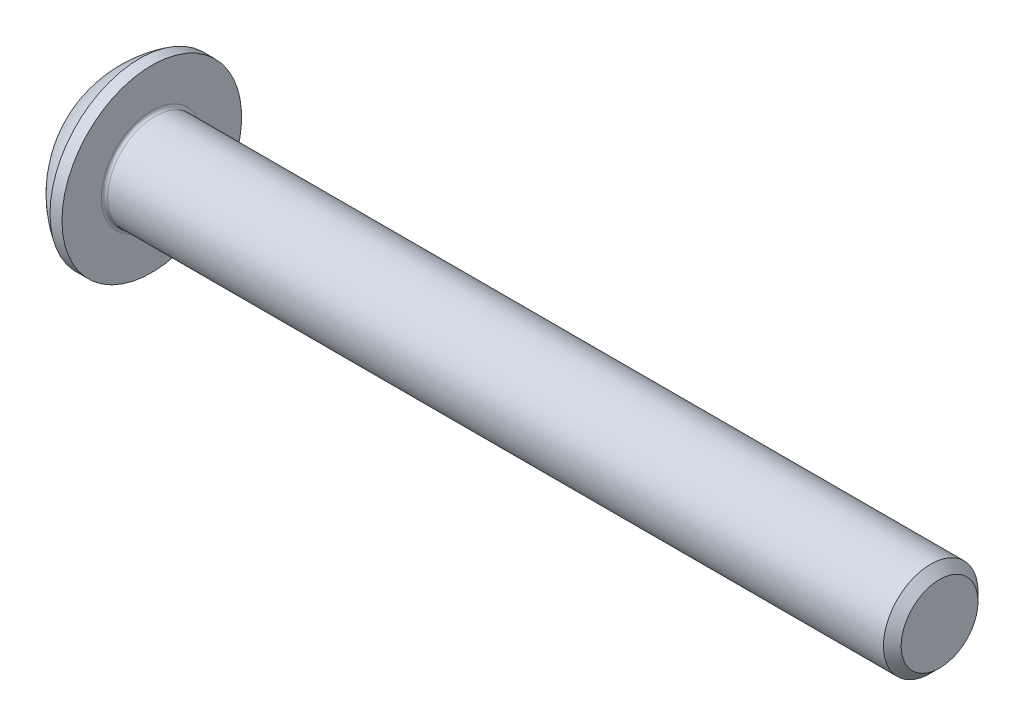
ISO-10303-21;
HEADER;
FILE_DESCRIPTION(('STEP AP214'),'2;1');
FILE_NAME('part.step','',(''),(''),'','','');
FILE_SCHEMA(('AUTOMOTIVE_DESIGN { 1 0 10303 214 1 1 1 1 }'));
ENDSEC;
DATA;
#1=APPLICATION_CONTEXT('core data for automotive mechanical design processes');
#2=APPLICATION_PROTOCOL_DEFINITION('international standard','automotive_design',2000,#1);
#3=PRODUCT_CONTEXT('',#1,'mechanical');
#4=PRODUCT('Part','Part','',(#3));
#5=PRODUCT_RELATED_PRODUCT_CATEGORY('part','',(#4));
#6=PRODUCT_DEFINITION_FORMATION('','',#4);
#7=PRODUCT_DEFINITION_CONTEXT('part definition',#1,'design');
#8=PRODUCT_DEFINITION('design','',#6,#7);
#9=PRODUCT_DEFINITION_SHAPE('','',#8);
#10=(LENGTH_UNIT() NAMED_UNIT(*) SI_UNIT(.MILLI.,.METRE.));
#11=(NAMED_UNIT(*) PLANE_ANGLE_UNIT() SI_UNIT($,.RADIAN.));
#12=(NAMED_UNIT(*) SI_UNIT($,.STERADIAN.) SOLID_ANGLE_UNIT());
#13=UNCERTAINTY_MEASURE_WITH_UNIT(LENGTH_MEASURE(1.E-05),#10,'distance_accuracy_value','');
#14=(GEOMETRIC_REPRESENTATION_CONTEXT(3) GLOBAL_UNCERTAINTY_ASSIGNED_CONTEXT((#13)) GLOBAL_UNIT_ASSIGNED_CONTEXT((#10,
#11,#12)) REPRESENTATION_CONTEXT('',''));
#15=CARTESIAN_POINT('',(0.,0.,0.));
#16=DIRECTION('',(0.,0.,1.));
#17=DIRECTION('',(1.,0.,0.));
#18=AXIS2_PLACEMENT_3D('',#15,#16,#17);
#19=CARTESIAN_POINT('',(-998.38264973081,0.,0.));
#20=DIRECTION('',(-1.,0.,0.));
#21=DIRECTION('',(0.,0.,1.));
#22=AXIS2_PLACEMENT_3D('',#19,#20,#21);
#23=CONICAL_SURFACE('',#22,1732.05080756886,1.04719755119659);
#24=CARTESIAN_POINT('',(1.61735026918963,0.,0.));
#25=VERTEX_POINT('',#24);
#26=VERTEX_LOOP('',#25);
#27=FACE_BOUND('',#26,.T.);
#28=CARTESIAN_POINT('',(1.04,0.,0.));
#29=DIRECTION('',(-1.,0.,0.));
#30=DIRECTION('',(0.,0.,1.));
#31=AXIS2_PLACEMENT_3D('',#28,#29,#30);
#32=CIRCLE('',#31,1.);
#33=CARTESIAN_POINT('',(1.04,0.86602540378444,-0.5));
#34=VERTEX_POINT('',#33);
#35=CARTESIAN_POINT('',(1.04,0.,-1.));
#36=VERTEX_POINT('',#35);
#37=EDGE_CURVE('E121',#34,#36,#32,.T.);
#38=ORIENTED_EDGE('',*,*,#37,.T.);
#39=CARTESIAN_POINT('',(1.04,0.,0.));
#40=DIRECTION('',(-1.,0.,0.));
#41=DIRECTION('',(0.,0.,1.));
#42=AXIS2_PLACEMENT_3D('',#39,#40,#41);
#43=CIRCLE('',#42,1.);
#44=CARTESIAN_POINT('',(1.04,-0.86602540378444,-0.5));
#45=VERTEX_POINT('',#44);
#46=EDGE_CURVE('E125',#36,#45,#43,.T.);
#47=ORIENTED_EDGE('',*,*,#46,.T.);
#48=CARTESIAN_POINT('',(1.04,0.,0.));
#49=DIRECTION('',(-1.,0.,0.));
#50=DIRECTION('',(0.,0.,1.));
#51=AXIS2_PLACEMENT_3D('',#48,#49,#50);
#52=CIRCLE('',#51,1.);
#53=CARTESIAN_POINT('',(1.04,-0.866025403784437,0.5));
#54=VERTEX_POINT('',#53);
#55=EDGE_CURVE('E175',#45,#54,#52,.T.);
#56=ORIENTED_EDGE('',*,*,#55,.T.);
#57=CARTESIAN_POINT('',(1.04,0.,0.));
#58=DIRECTION('',(-1.,0.,0.));
#59=DIRECTION('',(0.,0.,1.));
#60=AXIS2_PLACEMENT_3D('',#57,#58,#59);
#61=CIRCLE('',#60,1.);
#62=CARTESIAN_POINT('',(1.04,0.,1.));
#63=VERTEX_POINT('',#62);
#64=EDGE_CURVE('E185',#54,#63,#61,.T.);
#65=ORIENTED_EDGE('',*,*,#64,.T.);
#66=CARTESIAN_POINT('',(1.04,0.,0.));
#67=DIRECTION('',(-1.,0.,0.));
#68=DIRECTION('',(0.,0.,1.));
#69=AXIS2_PLACEMENT_3D('',#66,#67,#68);
#70=CIRCLE('',#69,1.);
#71=CARTESIAN_POINT('',(1.04,0.86602540378444,0.5));
#72=VERTEX_POINT('',#71);
#73=EDGE_CURVE('E161',#63,#72,#70,.T.);
#74=ORIENTED_EDGE('',*,*,#73,.T.);
#75=CARTESIAN_POINT('',(1.04,0.,0.));
#76=DIRECTION('',(-1.,0.,0.));
#77=DIRECTION('',(0.,0.,1.));
#78=AXIS2_PLACEMENT_3D('',#75,#76,#77);
#79=CIRCLE('',#78,1.);
#80=EDGE_CURVE('E128',#72,#34,#79,.T.);
#81=ORIENTED_EDGE('',*,*,#80,.T.);
#82=EDGE_LOOP('',(#38,#47,#56,#65,#74,#81));
#83=FACE_BOUND('',#82,.T.);
#84=ADVANCED_FACE('F17',(#27,#83),#23,.F.);
#85=CARTESIAN_POINT('',(1.75,0.,0.));
#86=DIRECTION('',(-1.,0.,0.));
#87=DIRECTION('',(0.,0.,1.));
#88=AXIS2_PLACEMENT_3D('',#85,#86,#87);
#89=TOROIDAL_SURFACE('',#88,1.6,0.1);
#90=CARTESIAN_POINT('',(1.65,0.,0.));
#91=DIRECTION('',(-1.,0.,0.));
#92=DIRECTION('',(0.,0.,1.));
#93=AXIS2_PLACEMENT_3D('',#90,#91,#92);
#94=CIRCLE('',#93,1.6);
#95=CARTESIAN_POINT('',(1.65,0.,1.6));
#96=VERTEX_POINT('',#95);
#97=EDGE_CURVE('E244',#96,#96,#94,.T.);
#98=ORIENTED_EDGE('',*,*,#97,.F.);
#99=EDGE_LOOP('',(#98));
#100=FACE_BOUND('',#99,.T.);
#101=CARTESIAN_POINT('',(1.75,0.,0.));
#102=DIRECTION('',(1.,0.,0.));
#103=DIRECTION('',(0.,0.,1.));
#104=AXIS2_PLACEMENT_3D('',#101,#102,#103);
#105=CIRCLE('',#104,1.5);
#106=CARTESIAN_POINT('',(1.75,0.,1.5));
#107=VERTEX_POINT('',#106);
#108=EDGE_CURVE('E11',#107,#107,#105,.T.);
#109=ORIENTED_EDGE('',*,*,#108,.F.);
#110=EDGE_LOOP('',(#109));
#111=FACE_BOUND('',#110,.T.);
#112=ADVANCED_FACE('F118',(#100,#111),#89,.F.);
#113=CARTESIAN_POINT('',(26.65,0.,0.));
#114=DIRECTION('',(-1.,0.,0.));
#115=DIRECTION('',(0.,0.,1.));
#116=AXIS2_PLACEMENT_3D('',#113,#114,#115);
#117=CONICAL_SURFACE('',#116,1.2195,0.785398163397432);
#118=CARTESIAN_POINT('',(26.3695,0.,0.));
#119=DIRECTION('',(-1.,0.,0.));
#120=DIRECTION('',(0.,0.,1.));
#121=AXIS2_PLACEMENT_3D('',#118,#119,#120);
#122=CIRCLE('',#121,1.5);
#123=CARTESIAN_POINT('',(26.3695,0.,1.5));
#124=VERTEX_POINT('',#123);
#125=EDGE_CURVE('E26',#124,#124,#122,.T.);
#126=ORIENTED_EDGE('',*,*,#125,.F.);
#127=EDGE_LOOP('',(#126));
#128=FACE_BOUND('',#127,.T.);
#129=CARTESIAN_POINT('',(26.65,0.,0.));
#130=DIRECTION('',(-1.,0.,0.));
#131=DIRECTION('',(0.,0.,1.));
#132=AXIS2_PLACEMENT_3D('',#129,#130,#131);
#133=CIRCLE('',#132,1.2195);
#134=CARTESIAN_POINT('',(26.65,0.,1.2195));
#135=VERTEX_POINT('',#134);
#136=EDGE_CURVE('E240',#135,#135,#133,.T.);
#137=ORIENTED_EDGE('',*,*,#136,.T.);
#138=EDGE_LOOP('',(#137));
#139=FACE_BOUND('',#138,.T.);
#140=ADVANCED_FACE('F262',(#128,#139),#117,.T.);
#141=CARTESIAN_POINT('',(0.,0.,0.));
#142=DIRECTION('',(-1.,0.,0.));
#143=DIRECTION('',(0.,0.,1.));
#144=AXIS2_PLACEMENT_3D('',#141,#142,#143);
#145=CYLINDRICAL_SURFACE('',#144,1.5);
#146=ORIENTED_EDGE('',*,*,#108,.T.);
#147=EDGE_LOOP('',(#146));
#148=FACE_BOUND('',#147,.T.);
#149=ORIENTED_EDGE('',*,*,#125,.T.);
#150=EDGE_LOOP('',(#149));
#151=FACE_BOUND('',#150,.T.);
#152=ADVANCED_FACE('F260',(#148,#151),#145,.T.);
#153=CARTESIAN_POINT('',(0.,0.,0.));
#154=DIRECTION('',(-1.,0.,0.));
#155=DIRECTION('',(0.,0.,1.));
#156=AXIS2_PLACEMENT_3D('',#153,#154,#155);
#157=CYLINDRICAL_SURFACE('',#156,2.85);
#158=CARTESIAN_POINT('',(1.27,0.,0.));
#159=DIRECTION('',(-1.,0.,0.));
#160=DIRECTION('',(0.,0.,1.));
#161=AXIS2_PLACEMENT_3D('',#158,#159,#160);
#162=CIRCLE('',#161,2.85);
#163=CARTESIAN_POINT('',(1.27,0.,2.85));
#164=VERTEX_POINT('',#163);
#165=EDGE_CURVE('E168',#164,#164,#162,.T.);
#166=ORIENTED_EDGE('',*,*,#165,.F.);
#167=EDGE_LOOP('',(#166));
#168=FACE_BOUND('',#167,.T.);
#169=CARTESIAN_POINT('',(1.65,0.,0.));
#170=DIRECTION('',(-1.,0.,0.));
#171=DIRECTION('',(0.,0.,1.));
#172=AXIS2_PLACEMENT_3D('',#169,#170,#171);
#173=CIRCLE('',#172,2.85);
#174=CARTESIAN_POINT('',(1.65,0.,2.85));
#175=VERTEX_POINT('',#174);
#176=EDGE_CURVE('E248',#175,#175,#173,.T.);
#177=ORIENTED_EDGE('',*,*,#176,.T.);
#178=EDGE_LOOP('',(#177));
#179=FACE_BOUND('',#178,.T.);
#180=ADVANCED_FACE('F291',(#168,#179),#157,.T.);
#181=CARTESIAN_POINT('',(3.03337598425198,0.,0.));
#182=DIRECTION('',(0.,0.,-1.));
#183=DIRECTION('',(0.,1.,0.));
#184=AXIS2_PLACEMENT_3D('',#181,#182,#183);
#185=SPHERICAL_SURFACE('',#184,3.35141684393879);
#186=CARTESIAN_POINT('',(3.03337598425198,0.,0.));
#187=DIRECTION('',(-1.,0.,0.));
#188=DIRECTION('',(0.,0.,1.));
#189=AXIS2_PLACEMENT_3D('',#186,#187,#188);
#190=SPHERICAL_SURFACE('',#189,3.35141684393879);
#191=ORIENTED_EDGE('',*,*,#165,.T.);
#192=EDGE_LOOP('',(#191));
#193=FACE_BOUND('',#192,.T.);
#194=CARTESIAN_POINT('',(0.,0.,0.));
#195=DIRECTION('',(-1.,0.,0.));
#196=DIRECTION('',(0.,0.,1.));
#197=AXIS2_PLACEMENT_3D('',#194,#195,#196);
#198=CIRCLE('',#197,1.425);
#199=CARTESIAN_POINT('',(0.,0.,1.425));
#200=VERTEX_POINT('',#199);
#201=EDGE_CURVE('E172',#200,#200,#198,.T.);
#202=ORIENTED_EDGE('',*,*,#201,.F.);
#203=EDGE_LOOP('',(#202));
#204=FACE_BOUND('',#203,.T.);
#205=ADVANCED_FACE('F287',(#193,#204),#190,.T.);
#206=CARTESIAN_POINT('',(0.,0.,0.));
#207=DIRECTION('',(-1.,0.,0.));
#208=DIRECTION('',(0.,0.,1.));
#209=AXIS2_PLACEMENT_3D('',#206,#207,#208);
#210=PLANE('',#209);
#211=ORIENTED_EDGE('',*,*,#201,.T.);
#212=EDGE_LOOP('',(#211));
#213=FACE_BOUND('',#212,.T.);
#214=DIRECTION('',(0.,-1.,0.));
#215=VECTOR('',#214,1.);
#216=CARTESIAN_POINT('',(0.,-0.577350269189625,1.));
#217=LINE('',#216,#215);
#218=CARTESIAN_POINT('',(0.,0.577350269189628,1.));
#219=VERTEX_POINT('',#218);
#220=CARTESIAN_POINT('',(0.,-0.577350269189625,1.));
#221=VERTEX_POINT('',#220);
#222=EDGE_CURVE('E220',#219,#221,#217,.T.);
#223=ORIENTED_EDGE('',*,*,#222,.T.);
#224=DIRECTION('',(0.,-0.5,-0.866025403784439));
#225=VECTOR('',#224,1.);
#226=CARTESIAN_POINT('',(0.,-1.15470053837925,0.));
#227=LINE('',#226,#225);
#228=CARTESIAN_POINT('',(0.,-1.15470053837925,0.));
#229=VERTEX_POINT('',#228);
#230=EDGE_CURVE('E38',#221,#229,#227,.T.);
#231=ORIENTED_EDGE('',*,*,#230,.T.);
#232=DIRECTION('',(0.,0.5,-0.866025403784439));
#233=VECTOR('',#232,1.);
#234=CARTESIAN_POINT('',(0.,-0.577350269189626,-1.));
#235=LINE('',#234,#233);
#236=CARTESIAN_POINT('',(0.,-0.577350269189626,-1.));
#237=VERTEX_POINT('',#236);
#238=EDGE_CURVE('E213',#229,#237,#235,.T.);
#239=ORIENTED_EDGE('',*,*,#238,.T.);
#240=DIRECTION('',(0.,1.,0.));
#241=VECTOR('',#240,1.);
#242=CARTESIAN_POINT('',(0.,0.577350269189628,-1.));
#243=LINE('',#242,#241);
#244=CARTESIAN_POINT('',(0.,0.577350269189628,-1.));
#245=VERTEX_POINT('',#244);
#246=EDGE_CURVE('E201',#237,#245,#243,.T.);
#247=ORIENTED_EDGE('',*,*,#246,.T.);
#248=DIRECTION('',(0.,0.5,0.866025403784439));
#249=VECTOR('',#248,1.);
#250=CARTESIAN_POINT('',(0.,1.15470053837925,0.));
#251=LINE('',#250,#249);
#252=CARTESIAN_POINT('',(0.,1.15470053837925,0.));
#253=VERTEX_POINT('',#252);
#254=EDGE_CURVE('E202',#245,#253,#251,.T.);
#255=ORIENTED_EDGE('',*,*,#254,.T.);
#256=DIRECTION('',(0.,-0.5,0.866025403784439));
#257=VECTOR('',#256,1.);
#258=CARTESIAN_POINT('',(0.,0.577350269189628,1.));
#259=LINE('',#258,#257);
#260=EDGE_CURVE('E227',#253,#219,#259,.T.);
#261=ORIENTED_EDGE('',*,*,#260,.T.);
#262=EDGE_LOOP('',(#223,#231,#239,#247,#255,#261));
#263=FACE_BOUND('',#262,.T.);
#264=ADVANCED_FACE('F281',(#213,#263),#210,.T.);
#265=CARTESIAN_POINT('',(1.65,1.5,0.));
#266=DIRECTION('',(-1.,0.,0.));
#267=DIRECTION('',(0.,0.,1.));
#268=AXIS2_PLACEMENT_3D('',#265,#266,#267);
#269=PLANE('',#268);
#270=ORIENTED_EDGE('',*,*,#176,.F.);
#271=EDGE_LOOP('',(#270));
#272=FACE_BOUND('',#271,.T.);
#273=ORIENTED_EDGE('',*,*,#97,.T.);
#274=EDGE_LOOP('',(#273));
#275=FACE_BOUND('',#274,.T.);
#276=ADVANCED_FACE('F271',(#272,#275),#269,.F.);
#277=CARTESIAN_POINT('',(26.65,0.,0.));
#278=DIRECTION('',(-1.,0.,0.));
#279=DIRECTION('',(0.,0.,1.));
#280=AXIS2_PLACEMENT_3D('',#277,#278,#279);
#281=PLANE('',#280);
#282=ORIENTED_EDGE('',*,*,#136,.F.);
#283=EDGE_LOOP('',(#282));
#284=FACE_BOUND('',#283,.T.);
#285=ADVANCED_FACE('F268',(#284),#281,.F.);
#286=CARTESIAN_POINT('',(1.04,-1.15470053837925,0.));
#287=DIRECTION('',(0.,0.866025403784439,-0.5));
#288=DIRECTION('',(-1.,0.,0.));
#289=AXIS2_PLACEMENT_3D('',#286,#287,#288);
#290=PLANE('',#289);
#291=DIRECTION('',(0.,-0.5,-0.866025403784439));
#292=VECTOR('',#291,1.);
#293=CARTESIAN_POINT('',(1.04,-1.15470053837925,0.));
#294=LINE('',#293,#292);
#295=CARTESIAN_POINT('',(1.04,-0.577350269189625,1.));
#296=VERTEX_POINT('',#295);
#297=EDGE_CURVE('E189',#296,#54,#294,.T.);
#298=ORIENTED_EDGE('',*,*,#297,.T.);
#299=DIRECTION('',(0.,-0.5,-0.866025403784439));
#300=VECTOR('',#299,1.);
#301=CARTESIAN_POINT('',(1.04,-1.15470053837925,0.));
#302=LINE('',#301,#300);
#303=CARTESIAN_POINT('',(1.04,-1.15470053837925,0.));
#304=VERTEX_POINT('',#303);
#305=EDGE_CURVE('E181',#54,#304,#302,.T.);
#306=ORIENTED_EDGE('',*,*,#305,.T.);
#307=DIRECTION('',(-1.,0.,0.));
#308=VECTOR('',#307,1.);
#309=CARTESIAN_POINT('',(1.04,-1.15470053837925,0.));
#310=LINE('',#309,#308);
#311=EDGE_CURVE('E216',#304,#229,#310,.T.);
#312=ORIENTED_EDGE('',*,*,#311,.T.);
#313=ORIENTED_EDGE('',*,*,#230,.F.);
#314=DIRECTION('',(-1.,0.,0.));
#315=VECTOR('',#314,1.);
#316=CARTESIAN_POINT('',(1.04,-0.577350269189625,1.));
#317=LINE('',#316,#315);
#318=EDGE_CURVE('E212',#296,#221,#317,.T.);
#319=ORIENTED_EDGE('',*,*,#318,.F.);
#320=EDGE_LOOP('',(#298,#306,#312,#313,#319));
#321=FACE_BOUND('',#320,.T.);
#322=ADVANCED_FACE('F270',(#321),#290,.T.);
#323=CARTESIAN_POINT('',(1.04,-0.577350269189626,-1.));
#324=DIRECTION('',(0.,0.866025403784439,0.5));
#325=DIRECTION('',(1.,0.,0.));
#326=AXIS2_PLACEMENT_3D('',#323,#324,#325);
#327=PLANE('',#326);
#328=DIRECTION('',(0.,0.5,-0.866025403784439));
#329=VECTOR('',#328,1.);
#330=CARTESIAN_POINT('',(1.04,-0.577350269189626,-1.));
#331=LINE('',#330,#329);
#332=EDGE_CURVE('E178',#304,#45,#331,.T.);
#333=ORIENTED_EDGE('',*,*,#332,.T.);
#334=DIRECTION('',(0.,0.5,-0.866025403784439));
#335=VECTOR('',#334,1.);
#336=CARTESIAN_POINT('',(1.04,-0.577350269189626,-1.));
#337=LINE('',#336,#335);
#338=CARTESIAN_POINT('',(1.04,-0.577350269189626,-1.));
#339=VERTEX_POINT('',#338);
#340=EDGE_CURVE('E146',#45,#339,#337,.T.);
#341=ORIENTED_EDGE('',*,*,#340,.T.);
#342=DIRECTION('',(-1.,0.,0.));
#343=VECTOR('',#342,1.);
#344=CARTESIAN_POINT('',(1.04,-0.577350269189626,-1.));
#345=LINE('',#344,#343);
#346=EDGE_CURVE('E141',#339,#237,#345,.T.);
#347=ORIENTED_EDGE('',*,*,#346,.T.);
#348=ORIENTED_EDGE('',*,*,#238,.F.);
#349=ORIENTED_EDGE('',*,*,#311,.F.);
#350=EDGE_LOOP('',(#333,#341,#347,#348,#349));
#351=FACE_BOUND('',#350,.T.);
#352=ADVANCED_FACE('F278',(#351),#327,.T.);
#353=CARTESIAN_POINT('',(1.04,0.577350269189628,-1.));
#354=DIRECTION('',(0.,0.,1.));
#355=DIRECTION('',(1.,0.,0.));
#356=AXIS2_PLACEMENT_3D('',#353,#354,#355);
#357=PLANE('',#356);
#358=DIRECTION('',(0.,1.,0.));
#359=VECTOR('',#358,1.);
#360=CARTESIAN_POINT('',(1.04,0.577350269189628,-1.));
#361=LINE('',#360,#359);
#362=EDGE_CURVE('E136',#339,#36,#361,.T.);
#363=ORIENTED_EDGE('',*,*,#362,.T.);
#364=DIRECTION('',(0.,1.,0.));
#365=VECTOR('',#364,1.);
#366=CARTESIAN_POINT('',(1.04,0.577350269189628,-1.));
#367=LINE('',#366,#365);
#368=CARTESIAN_POINT('',(1.04,0.577350269189628,-1.));
#369=VERTEX_POINT('',#368);
#370=EDGE_CURVE('E110',#36,#369,#367,.T.);
#371=ORIENTED_EDGE('',*,*,#370,.T.);
#372=DIRECTION('',(-1.,0.,0.));
#373=VECTOR('',#372,1.);
#374=CARTESIAN_POINT('',(1.04,0.577350269189628,-1.));
#375=LINE('',#374,#373);
#376=EDGE_CURVE('E198',#369,#245,#375,.T.);
#377=ORIENTED_EDGE('',*,*,#376,.T.);
#378=ORIENTED_EDGE('',*,*,#246,.F.);
#379=ORIENTED_EDGE('',*,*,#346,.F.);
#380=EDGE_LOOP('',(#363,#371,#377,#378,#379));
#381=FACE_BOUND('',#380,.T.);
#382=ADVANCED_FACE('F137',(#381),#357,.T.);
#383=CARTESIAN_POINT('',(1.04,1.15470053837925,0.));
#384=DIRECTION('',(0.,-0.866025403784439,0.5));
#385=DIRECTION('',(-1.,0.,0.));
#386=AXIS2_PLACEMENT_3D('',#383,#384,#385);
#387=PLANE('',#386);
#388=DIRECTION('',(0.,0.5,0.866025403784439));
#389=VECTOR('',#388,1.);
#390=CARTESIAN_POINT('',(1.04,1.15470053837925,0.));
#391=LINE('',#390,#389);
#392=EDGE_CURVE('E131',#369,#34,#391,.T.);
#393=ORIENTED_EDGE('',*,*,#392,.T.);
#394=DIRECTION('',(0.,0.5,0.866025403784439));
#395=VECTOR('',#394,1.);
#396=CARTESIAN_POINT('',(1.04,1.15470053837925,0.));
#397=LINE('',#396,#395);
#398=CARTESIAN_POINT('',(1.04,1.15470053837925,0.));
#399=VERTEX_POINT('',#398);
#400=EDGE_CURVE('E132',#34,#399,#397,.T.);
#401=ORIENTED_EDGE('',*,*,#400,.T.);
#402=DIRECTION('',(-1.,0.,0.));
#403=VECTOR('',#402,1.);
#404=CARTESIAN_POINT('',(1.04,1.15470053837925,0.));
#405=LINE('',#404,#403);
#406=EDGE_CURVE('E156',#399,#253,#405,.T.);
#407=ORIENTED_EDGE('',*,*,#406,.T.);
#408=ORIENTED_EDGE('',*,*,#254,.F.);
#409=ORIENTED_EDGE('',*,*,#376,.F.);
#410=EDGE_LOOP('',(#393,#401,#407,#408,#409));
#411=FACE_BOUND('',#410,.T.);
#412=ADVANCED_FACE('F376',(#411),#387,.T.);
#413=CARTESIAN_POINT('',(1.04,0.577350269189628,1.));
#414=DIRECTION('',(0.,-0.866025403784439,-0.5));
#415=DIRECTION('',(0.,0.5,-0.866025403784439));
#416=AXIS2_PLACEMENT_3D('',#413,#414,#415);
#417=PLANE('',#416);
#418=DIRECTION('',(0.,-0.5,0.866025403784439));
#419=VECTOR('',#418,1.);
#420=CARTESIAN_POINT('',(1.04,0.577350269189628,1.));
#421=LINE('',#420,#419);
#422=EDGE_CURVE('E166',#399,#72,#421,.T.);
#423=ORIENTED_EDGE('',*,*,#422,.T.);
#424=DIRECTION('',(0.,-0.5,0.866025403784439));
#425=VECTOR('',#424,1.);
#426=CARTESIAN_POINT('',(1.04,0.577350269189628,1.));
#427=LINE('',#426,#425);
#428=CARTESIAN_POINT('',(1.04,0.577350269189628,1.));
#429=VERTEX_POINT('',#428);
#430=EDGE_CURVE('E160',#72,#429,#427,.T.);
#431=ORIENTED_EDGE('',*,*,#430,.T.);
#432=DIRECTION('',(-1.,0.,0.));
#433=VECTOR('',#432,1.);
#434=CARTESIAN_POINT('',(1.04,0.577350269189628,1.));
#435=LINE('',#434,#433);
#436=EDGE_CURVE('E223',#429,#219,#435,.T.);
#437=ORIENTED_EDGE('',*,*,#436,.T.);
#438=ORIENTED_EDGE('',*,*,#260,.F.);
#439=ORIENTED_EDGE('',*,*,#406,.F.);
#440=EDGE_LOOP('',(#423,#431,#437,#438,#439));
#441=FACE_BOUND('',#440,.T.);
#442=ADVANCED_FACE('F386',(#441),#417,.T.);
#443=CARTESIAN_POINT('',(1.04,-0.577350269189625,1.));
#444=DIRECTION('',(0.,0.,-1.));
#445=DIRECTION('',(-1.,0.,0.));
#446=AXIS2_PLACEMENT_3D('',#443,#444,#445);
#447=PLANE('',#446);
#448=DIRECTION('',(0.,-1.,0.));
#449=VECTOR('',#448,1.);
#450=CARTESIAN_POINT('',(1.04,-0.577350269189625,1.));
#451=LINE('',#450,#449);
#452=EDGE_CURVE('E157',#429,#63,#451,.T.);
#453=ORIENTED_EDGE('',*,*,#452,.T.);
#454=DIRECTION('',(0.,-1.,0.));
#455=VECTOR('',#454,1.);
#456=CARTESIAN_POINT('',(1.04,-0.577350269189625,1.));
#457=LINE('',#456,#455);
#458=EDGE_CURVE('E164',#63,#296,#457,.T.);
#459=ORIENTED_EDGE('',*,*,#458,.T.);
#460=ORIENTED_EDGE('',*,*,#318,.T.);
#461=ORIENTED_EDGE('',*,*,#222,.F.);
#462=ORIENTED_EDGE('',*,*,#436,.F.);
#463=EDGE_LOOP('',(#453,#459,#460,#461,#462));
#464=FACE_BOUND('',#463,.T.);
#465=ADVANCED_FACE('F397',(#464),#447,.T.);
#466=CARTESIAN_POINT('',(1.04,-1.73205080756887,-1.));
#467=DIRECTION('',(1.,0.,0.));
#468=DIRECTION('',(0.,1.,0.));
#469=AXIS2_PLACEMENT_3D('',#466,#467,#468);
#470=PLANE('',#469);
#471=ORIENTED_EDGE('',*,*,#37,.F.);
#472=ORIENTED_EDGE('',*,*,#392,.F.);
#473=ORIENTED_EDGE('',*,*,#370,.F.);
#474=EDGE_LOOP('',(#471,#472,#473));
#475=FACE_BOUND('',#474,.T.);
#476=ADVANCED_FACE('F408',(#475),#470,.F.);
#477=CARTESIAN_POINT('',(1.04,-1.73205080756887,-1.));
#478=DIRECTION('',(1.,0.,0.));
#479=DIRECTION('',(0.,1.,0.));
#480=AXIS2_PLACEMENT_3D('',#477,#478,#479);
#481=PLANE('',#480);
#482=ORIENTED_EDGE('',*,*,#80,.F.);
#483=ORIENTED_EDGE('',*,*,#422,.F.);
#484=ORIENTED_EDGE('',*,*,#400,.F.);
#485=EDGE_LOOP('',(#482,#483,#484));
#486=FACE_BOUND('',#485,.T.);
#487=ADVANCED_FACE('F419',(#486),#481,.F.);
#488=CARTESIAN_POINT('',(1.04,-1.73205080756887,-1.));
#489=DIRECTION('',(1.,0.,0.));
#490=DIRECTION('',(0.,1.,0.));
#491=AXIS2_PLACEMENT_3D('',#488,#489,#490);
#492=PLANE('',#491);
#493=ORIENTED_EDGE('',*,*,#73,.F.);
#494=ORIENTED_EDGE('',*,*,#452,.F.);
#495=ORIENTED_EDGE('',*,*,#430,.F.);
#496=EDGE_LOOP('',(#493,#494,#495));
#497=FACE_BOUND('',#496,.T.);
#498=ADVANCED_FACE('F429',(#497),#492,.F.);
#499=CARTESIAN_POINT('',(1.04,-1.73205080756887,-1.));
#500=DIRECTION('',(1.,0.,0.));
#501=DIRECTION('',(0.,1.,0.));
#502=AXIS2_PLACEMENT_3D('',#499,#500,#501);
#503=PLANE('',#502);
#504=ORIENTED_EDGE('',*,*,#64,.F.);
#505=ORIENTED_EDGE('',*,*,#297,.F.);
#506=ORIENTED_EDGE('',*,*,#458,.F.);
#507=EDGE_LOOP('',(#504,#505,#506));
#508=FACE_BOUND('',#507,.T.);
#509=ADVANCED_FACE('F440',(#508),#503,.F.);
#510=CARTESIAN_POINT('',(1.04,-1.73205080756887,-1.));
#511=DIRECTION('',(1.,0.,0.));
#512=DIRECTION('',(0.,1.,0.));
#513=AXIS2_PLACEMENT_3D('',#510,#511,#512);
#514=PLANE('',#513);
#515=ORIENTED_EDGE('',*,*,#55,.F.);
#516=ORIENTED_EDGE('',*,*,#332,.F.);
#517=ORIENTED_EDGE('',*,*,#305,.F.);
#518=EDGE_LOOP('',(#515,#516,#517));
#519=FACE_BOUND('',#518,.T.);
#520=ADVANCED_FACE('F451',(#519),#514,.F.);
#521=CARTESIAN_POINT('',(1.04,-1.73205080756887,-1.));
#522=DIRECTION('',(1.,0.,0.));
#523=DIRECTION('',(0.,1.,0.));
#524=AXIS2_PLACEMENT_3D('',#521,#522,#523);
#525=PLANE('',#524);
#526=ORIENTED_EDGE('',*,*,#46,.F.);
#527=ORIENTED_EDGE('',*,*,#362,.F.);
#528=ORIENTED_EDGE('',*,*,#340,.F.);
#529=EDGE_LOOP('',(#526,#527,#528));
#530=FACE_BOUND('',#529,.T.);
#531=ADVANCED_FACE('F148',(#530),#525,.F.);
#532=CLOSED_SHELL('',(#84,#112,#140,#152,#180,#205,#264,#276,#285,#322,#352,#382,#412,#442,#465,
#476,#487,#498,#509,#520,#531));
#533=MANIFOLD_SOLID_BREP('B1',#532);
#534=ADVANCED_BREP_SHAPE_REPRESENTATION('',(#18,#533),#14);
#535=SHAPE_DEFINITION_REPRESENTATION(#9,#534);
ENDSEC;
END-ISO-10303-21;
